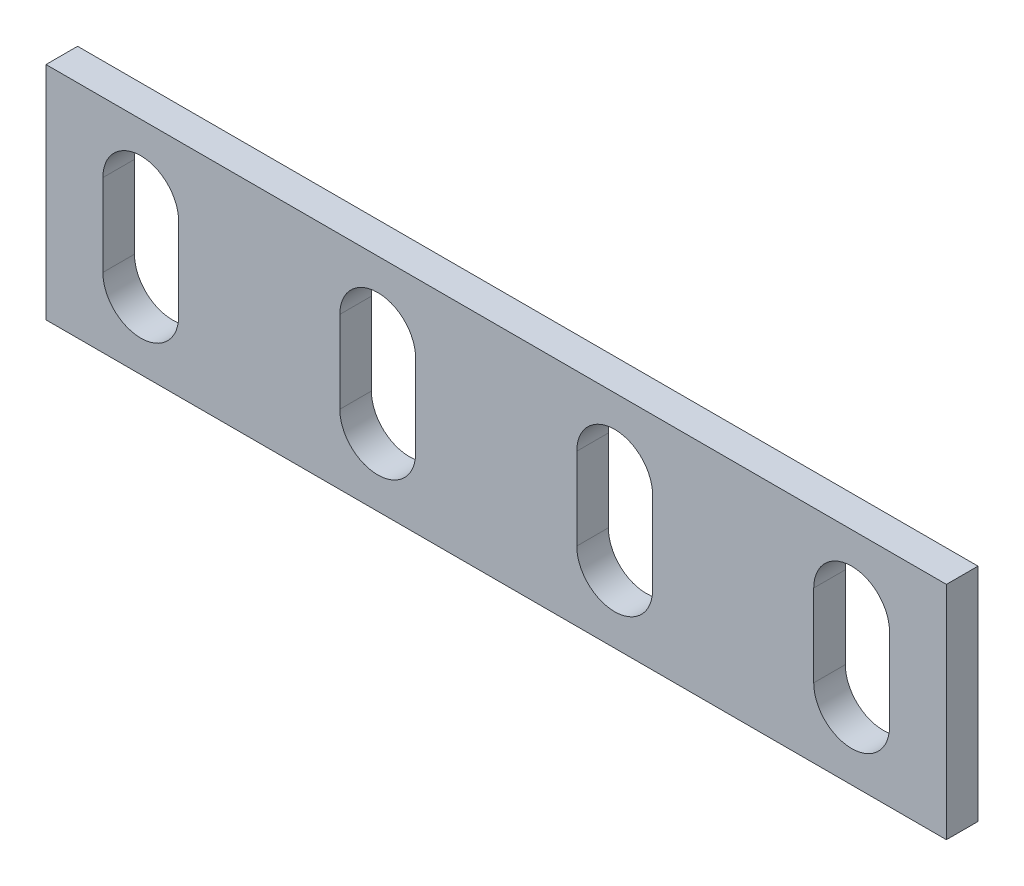
ISO-10303-21;
HEADER;
FILE_DESCRIPTION(('STEP AP214'),'2;1');
FILE_NAME('part.step','',(''),(''),'','','');
FILE_SCHEMA(('AUTOMOTIVE_DESIGN { 1 0 10303 214 1 1 1 1 }'));
ENDSEC;
DATA;
#1=APPLICATION_CONTEXT('core data for automotive mechanical design processes');
#2=APPLICATION_PROTOCOL_DEFINITION('international standard','automotive_design',2000,#1);
#3=PRODUCT_CONTEXT('',#1,'mechanical');
#4=PRODUCT('Part','Part','',(#3));
#5=PRODUCT_RELATED_PRODUCT_CATEGORY('part','',(#4));
#6=PRODUCT_DEFINITION_FORMATION('','',#4);
#7=PRODUCT_DEFINITION_CONTEXT('part definition',#1,'design');
#8=PRODUCT_DEFINITION('design','',#6,#7);
#9=PRODUCT_DEFINITION_SHAPE('','',#8);
#10=(LENGTH_UNIT() NAMED_UNIT(*) SI_UNIT(.MILLI.,.METRE.));
#11=(NAMED_UNIT(*) PLANE_ANGLE_UNIT() SI_UNIT($,.RADIAN.));
#12=(NAMED_UNIT(*) SI_UNIT($,.STERADIAN.) SOLID_ANGLE_UNIT());
#13=UNCERTAINTY_MEASURE_WITH_UNIT(LENGTH_MEASURE(1.E-05),#10,'distance_accuracy_value','');
#14=(GEOMETRIC_REPRESENTATION_CONTEXT(3) GLOBAL_UNCERTAINTY_ASSIGNED_CONTEXT((#13)) GLOBAL_UNIT_ASSIGNED_CONTEXT((#10,
#11,#12)) REPRESENTATION_CONTEXT('',''));
#15=CARTESIAN_POINT('',(0.,0.,0.));
#16=DIRECTION('',(0.,0.,1.));
#17=DIRECTION('',(1.,0.,0.));
#18=AXIS2_PLACEMENT_3D('',#15,#16,#17);
#19=CARTESIAN_POINT('',(0.,0.,20.));
#20=DIRECTION('',(0.,0.,1.));
#21=DIRECTION('',(1.,0.,0.));
#22=AXIS2_PLACEMENT_3D('',#19,#20,#21);
#23=PLANE('',#22);
#24=DIRECTION('',(0.,-1.,0.));
#25=VECTOR('',#24,1.);
#26=CARTESIAN_POINT('',(-285.,70.,20.));
#27=LINE('',#26,#25);
#28=CARTESIAN_POINT('',(-285.,70.,20.));
#29=VERTEX_POINT('',#28);
#30=CARTESIAN_POINT('',(-285.,-70.,20.));
#31=VERTEX_POINT('',#30);
#32=EDGE_CURVE('E354',#29,#31,#27,.T.);
#33=ORIENTED_EDGE('',*,*,#32,.T.);
#34=DIRECTION('',(1.,0.,0.));
#35=VECTOR('',#34,1.);
#36=CARTESIAN_POINT('',(-285.,-70.,20.));
#37=LINE('',#36,#35);
#38=CARTESIAN_POINT('',(285.,-70.,20.));
#39=VERTEX_POINT('',#38);
#40=EDGE_CURVE('E358',#31,#39,#37,.T.);
#41=ORIENTED_EDGE('',*,*,#40,.T.);
#42=DIRECTION('',(0.,1.,0.));
#43=VECTOR('',#42,1.);
#44=CARTESIAN_POINT('',(285.,70.,20.));
#45=LINE('',#44,#43);
#46=CARTESIAN_POINT('',(285.,70.,20.));
#47=VERTEX_POINT('',#46);
#48=EDGE_CURVE('E362',#39,#47,#45,.T.);
#49=ORIENTED_EDGE('',*,*,#48,.T.);
#50=DIRECTION('',(-1.,0.,0.));
#51=VECTOR('',#50,1.);
#52=CARTESIAN_POINT('',(-285.,70.,20.));
#53=LINE('',#52,#51);
#54=EDGE_CURVE('E365',#47,#29,#53,.T.);
#55=ORIENTED_EDGE('',*,*,#54,.T.);
#56=EDGE_LOOP('',(#33,#41,#49,#55));
#57=FACE_BOUND('',#56,.T.);
#58=DIRECTION('',(0.,-1.,0.));
#59=VECTOR('',#58,1.);
#60=CARTESIAN_POINT('',(51.,26.,20.));
#61=LINE('',#60,#59);
#62=CARTESIAN_POINT('',(51.,26.,20.));
#63=VERTEX_POINT('',#62);
#64=CARTESIAN_POINT('',(51.,-26.,20.));
#65=VERTEX_POINT('',#64);
#66=EDGE_CURVE('E314',#63,#65,#61,.T.);
#67=ORIENTED_EDGE('',*,*,#66,.F.);
#68=CARTESIAN_POINT('',(75.,26.,20.));
#69=DIRECTION('',(0.,0.,1.));
#70=DIRECTION('',(1.,0.,0.));
#71=AXIS2_PLACEMENT_3D('',#68,#69,#70);
#72=CIRCLE('',#71,24.);
#73=CARTESIAN_POINT('',(99.,26.,20.));
#74=VERTEX_POINT('',#73);
#75=EDGE_CURVE('E311',#74,#63,#72,.T.);
#76=ORIENTED_EDGE('',*,*,#75,.F.);
#77=DIRECTION('',(0.,1.,0.));
#78=VECTOR('',#77,1.);
#79=CARTESIAN_POINT('',(99.,26.,20.));
#80=LINE('',#79,#78);
#81=CARTESIAN_POINT('',(99.,-26.,20.));
#82=VERTEX_POINT('',#81);
#83=EDGE_CURVE('E322',#82,#74,#80,.T.);
#84=ORIENTED_EDGE('',*,*,#83,.F.);
#85=CARTESIAN_POINT('',(75.,-26.,20.));
#86=DIRECTION('',(0.,0.,1.));
#87=DIRECTION('',(1.,0.,0.));
#88=AXIS2_PLACEMENT_3D('',#85,#86,#87);
#89=CIRCLE('',#88,24.);
#90=EDGE_CURVE('E318',#65,#82,#89,.T.);
#91=ORIENTED_EDGE('',*,*,#90,.F.);
#92=EDGE_LOOP('',(#67,#76,#84,#91));
#93=FACE_BOUND('',#92,.T.);
#94=DIRECTION('',(0.,-1.,0.));
#95=VECTOR('',#94,1.);
#96=CARTESIAN_POINT('',(201.,26.,20.));
#97=LINE('',#96,#95);
#98=CARTESIAN_POINT('',(201.,26.,20.));
#99=VERTEX_POINT('',#98);
#100=CARTESIAN_POINT('',(201.,-26.,20.));
#101=VERTEX_POINT('',#100);
#102=EDGE_CURVE('E271',#99,#101,#97,.T.);
#103=ORIENTED_EDGE('',*,*,#102,.F.);
#104=CARTESIAN_POINT('',(225.,26.,20.));
#105=DIRECTION('',(0.,0.,1.));
#106=DIRECTION('',(1.,0.,0.));
#107=AXIS2_PLACEMENT_3D('',#104,#105,#106);
#108=CIRCLE('',#107,24.);
#109=CARTESIAN_POINT('',(249.,26.,20.));
#110=VERTEX_POINT('',#109);
#111=EDGE_CURVE('E268',#110,#99,#108,.T.);
#112=ORIENTED_EDGE('',*,*,#111,.F.);
#113=DIRECTION('',(0.,1.,0.));
#114=VECTOR('',#113,1.);
#115=CARTESIAN_POINT('',(249.,26.,20.));
#116=LINE('',#115,#114);
#117=CARTESIAN_POINT('',(249.,-26.,20.));
#118=VERTEX_POINT('',#117);
#119=EDGE_CURVE('E279',#118,#110,#116,.T.);
#120=ORIENTED_EDGE('',*,*,#119,.F.);
#121=CARTESIAN_POINT('',(225.,-26.,20.));
#122=DIRECTION('',(0.,0.,1.));
#123=DIRECTION('',(1.,0.,0.));
#124=AXIS2_PLACEMENT_3D('',#121,#122,#123);
#125=CIRCLE('',#124,24.);
#126=EDGE_CURVE('E275',#101,#118,#125,.T.);
#127=ORIENTED_EDGE('',*,*,#126,.F.);
#128=EDGE_LOOP('',(#103,#112,#120,#127));
#129=FACE_BOUND('',#128,.T.);
#130=DIRECTION('',(0.,-1.,0.));
#131=VECTOR('',#130,1.);
#132=CARTESIAN_POINT('',(-99.,26.,20.));
#133=LINE('',#132,#131);
#134=CARTESIAN_POINT('',(-99.,26.,20.));
#135=VERTEX_POINT('',#134);
#136=CARTESIAN_POINT('',(-99.,-26.,20.));
#137=VERTEX_POINT('',#136);
#138=EDGE_CURVE('E228',#135,#137,#133,.T.);
#139=ORIENTED_EDGE('',*,*,#138,.F.);
#140=CARTESIAN_POINT('',(-75.,26.,20.));
#141=DIRECTION('',(0.,0.,1.));
#142=DIRECTION('',(-1.,0.,0.));
#143=AXIS2_PLACEMENT_3D('',#140,#141,#142);
#144=CIRCLE('',#143,24.);
#145=CARTESIAN_POINT('',(-51.,26.,20.));
#146=VERTEX_POINT('',#145);
#147=EDGE_CURVE('E225',#146,#135,#144,.T.);
#148=ORIENTED_EDGE('',*,*,#147,.F.);
#149=DIRECTION('',(0.,1.,0.));
#150=VECTOR('',#149,1.);
#151=CARTESIAN_POINT('',(-51.,26.,20.));
#152=LINE('',#151,#150);
#153=CARTESIAN_POINT('',(-51.,-26.,20.));
#154=VERTEX_POINT('',#153);
#155=EDGE_CURVE('E236',#154,#146,#152,.T.);
#156=ORIENTED_EDGE('',*,*,#155,.F.);
#157=CARTESIAN_POINT('',(-75.,-26.,20.));
#158=DIRECTION('',(0.,0.,1.));
#159=DIRECTION('',(-1.,0.,0.));
#160=AXIS2_PLACEMENT_3D('',#157,#158,#159);
#161=CIRCLE('',#160,24.);
#162=EDGE_CURVE('E232',#137,#154,#161,.T.);
#163=ORIENTED_EDGE('',*,*,#162,.F.);
#164=EDGE_LOOP('',(#139,#148,#156,#163));
#165=FACE_BOUND('',#164,.T.);
#166=DIRECTION('',(0.,-1.,0.));
#167=VECTOR('',#166,1.);
#168=CARTESIAN_POINT('',(-249.,26.,20.));
#169=LINE('',#168,#167);
#170=CARTESIAN_POINT('',(-249.,26.,20.));
#171=VERTEX_POINT('',#170);
#172=CARTESIAN_POINT('',(-249.,-26.,20.));
#173=VERTEX_POINT('',#172);
#174=EDGE_CURVE('E186',#171,#173,#169,.T.);
#175=ORIENTED_EDGE('',*,*,#174,.F.);
#176=CARTESIAN_POINT('',(-225.,26.,20.));
#177=DIRECTION('',(0.,0.,1.));
#178=DIRECTION('',(-1.,0.,0.));
#179=AXIS2_PLACEMENT_3D('',#176,#177,#178);
#180=CIRCLE('',#179,24.);
#181=CARTESIAN_POINT('',(-201.,26.,20.));
#182=VERTEX_POINT('',#181);
#183=EDGE_CURVE('E177',#182,#171,#180,.T.);
#184=ORIENTED_EDGE('',*,*,#183,.F.);
#185=DIRECTION('',(0.,1.,0.));
#186=VECTOR('',#185,1.);
#187=CARTESIAN_POINT('',(-201.,26.,20.));
#188=LINE('',#187,#186);
#189=CARTESIAN_POINT('',(-201.,-26.,20.));
#190=VERTEX_POINT('',#189);
#191=EDGE_CURVE('E203',#190,#182,#188,.T.);
#192=ORIENTED_EDGE('',*,*,#191,.F.);
#193=CARTESIAN_POINT('',(-225.,-26.,20.));
#194=DIRECTION('',(0.,0.,1.));
#195=DIRECTION('',(-1.,0.,0.));
#196=AXIS2_PLACEMENT_3D('',#193,#194,#195);
#197=CIRCLE('',#196,24.);
#198=EDGE_CURVE('E199',#173,#190,#197,.T.);
#199=ORIENTED_EDGE('',*,*,#198,.F.);
#200=EDGE_LOOP('',(#175,#184,#192,#199));
#201=FACE_BOUND('',#200,.T.);
#202=ADVANCED_FACE('F39',(#57,#93,#129,#165,#201),#23,.T.);
#203=CARTESIAN_POINT('',(0.,0.,0.));
#204=DIRECTION('',(0.,0.,1.));
#205=DIRECTION('',(1.,0.,0.));
#206=AXIS2_PLACEMENT_3D('',#203,#204,#205);
#207=PLANE('',#206);
#208=CARTESIAN_POINT('',(-75.,26.,0.));
#209=DIRECTION('',(0.,0.,1.));
#210=DIRECTION('',(-1.,0.,0.));
#211=AXIS2_PLACEMENT_3D('',#208,#209,#210);
#212=CIRCLE('',#211,24.);
#213=CARTESIAN_POINT('',(-51.,26.,0.));
#214=VERTEX_POINT('',#213);
#215=CARTESIAN_POINT('',(-99.,26.,0.));
#216=VERTEX_POINT('',#215);
#217=EDGE_CURVE('E195',#214,#216,#212,.T.);
#218=ORIENTED_EDGE('',*,*,#217,.T.);
#219=DIRECTION('',(0.,-1.,0.));
#220=VECTOR('',#219,1.);
#221=CARTESIAN_POINT('',(-99.,26.,0.));
#222=LINE('',#221,#220);
#223=CARTESIAN_POINT('',(-99.,-26.,0.));
#224=VERTEX_POINT('',#223);
#225=EDGE_CURVE('E243',#216,#224,#222,.T.);
#226=ORIENTED_EDGE('',*,*,#225,.T.);
#227=CARTESIAN_POINT('',(-75.,-26.,0.));
#228=DIRECTION('',(0.,0.,1.));
#229=DIRECTION('',(-1.,0.,0.));
#230=AXIS2_PLACEMENT_3D('',#227,#228,#229);
#231=CIRCLE('',#230,24.);
#232=CARTESIAN_POINT('',(-51.,-26.,0.));
#233=VERTEX_POINT('',#232);
#234=EDGE_CURVE('E247',#224,#233,#231,.T.);
#235=ORIENTED_EDGE('',*,*,#234,.T.);
#236=DIRECTION('',(0.,1.,0.));
#237=VECTOR('',#236,1.);
#238=CARTESIAN_POINT('',(-51.,26.,0.));
#239=LINE('',#238,#237);
#240=EDGE_CURVE('E229',#233,#214,#239,.T.);
#241=ORIENTED_EDGE('',*,*,#240,.T.);
#242=EDGE_LOOP('',(#218,#226,#235,#241));
#243=FACE_BOUND('',#242,.T.);
#244=CARTESIAN_POINT('',(75.,26.,0.));
#245=DIRECTION('',(0.,0.,1.));
#246=DIRECTION('',(1.,0.,0.));
#247=AXIS2_PLACEMENT_3D('',#244,#245,#246);
#248=CIRCLE('',#247,24.);
#249=CARTESIAN_POINT('',(99.,26.,0.));
#250=VERTEX_POINT('',#249);
#251=CARTESIAN_POINT('',(51.,26.,0.));
#252=VERTEX_POINT('',#251);
#253=EDGE_CURVE('E310',#250,#252,#248,.T.);
#254=ORIENTED_EDGE('',*,*,#253,.T.);
#255=DIRECTION('',(0.,-1.,0.));
#256=VECTOR('',#255,1.);
#257=CARTESIAN_POINT('',(51.,26.,0.));
#258=LINE('',#257,#256);
#259=CARTESIAN_POINT('',(51.,-26.,0.));
#260=VERTEX_POINT('',#259);
#261=EDGE_CURVE('E329',#252,#260,#258,.T.);
#262=ORIENTED_EDGE('',*,*,#261,.T.);
#263=CARTESIAN_POINT('',(75.,-26.,0.));
#264=DIRECTION('',(0.,0.,1.));
#265=DIRECTION('',(1.,0.,0.));
#266=AXIS2_PLACEMENT_3D('',#263,#264,#265);
#267=CIRCLE('',#266,24.);
#268=CARTESIAN_POINT('',(99.,-26.,0.));
#269=VERTEX_POINT('',#268);
#270=EDGE_CURVE('E333',#260,#269,#267,.T.);
#271=ORIENTED_EDGE('',*,*,#270,.T.);
#272=DIRECTION('',(0.,1.,0.));
#273=VECTOR('',#272,1.);
#274=CARTESIAN_POINT('',(99.,26.,0.));
#275=LINE('',#274,#273);
#276=EDGE_CURVE('E315',#269,#250,#275,.T.);
#277=ORIENTED_EDGE('',*,*,#276,.T.);
#278=EDGE_LOOP('',(#254,#262,#271,#277));
#279=FACE_BOUND('',#278,.T.);
#280=DIRECTION('',(0.,-1.,0.));
#281=VECTOR('',#280,1.);
#282=CARTESIAN_POINT('',(-285.,70.,0.));
#283=LINE('',#282,#281);
#284=CARTESIAN_POINT('',(-285.,70.,0.));
#285=VERTEX_POINT('',#284);
#286=CARTESIAN_POINT('',(-285.,-70.,0.));
#287=VERTEX_POINT('',#286);
#288=EDGE_CURVE('E353',#285,#287,#283,.T.);
#289=ORIENTED_EDGE('',*,*,#288,.F.);
#290=DIRECTION('',(-1.,0.,0.));
#291=VECTOR('',#290,1.);
#292=CARTESIAN_POINT('',(-285.,70.,0.));
#293=LINE('',#292,#291);
#294=CARTESIAN_POINT('',(285.,70.,0.));
#295=VERTEX_POINT('',#294);
#296=EDGE_CURVE('E359',#295,#285,#293,.T.);
#297=ORIENTED_EDGE('',*,*,#296,.F.);
#298=DIRECTION('',(0.,1.,0.));
#299=VECTOR('',#298,1.);
#300=CARTESIAN_POINT('',(285.,70.,0.));
#301=LINE('',#300,#299);
#302=CARTESIAN_POINT('',(285.,-70.,0.));
#303=VERTEX_POINT('',#302);
#304=EDGE_CURVE('E375',#303,#295,#301,.T.);
#305=ORIENTED_EDGE('',*,*,#304,.F.);
#306=DIRECTION('',(1.,0.,0.));
#307=VECTOR('',#306,1.);
#308=CARTESIAN_POINT('',(-285.,-70.,0.));
#309=LINE('',#308,#307);
#310=EDGE_CURVE('E372',#287,#303,#309,.T.);
#311=ORIENTED_EDGE('',*,*,#310,.F.);
#312=EDGE_LOOP('',(#289,#297,#305,#311));
#313=FACE_BOUND('',#312,.T.);
#314=CARTESIAN_POINT('',(225.,26.,0.));
#315=DIRECTION('',(0.,0.,1.));
#316=DIRECTION('',(1.,0.,0.));
#317=AXIS2_PLACEMENT_3D('',#314,#315,#316);
#318=CIRCLE('',#317,24.);
#319=CARTESIAN_POINT('',(249.,26.,0.));
#320=VERTEX_POINT('',#319);
#321=CARTESIAN_POINT('',(201.,26.,0.));
#322=VERTEX_POINT('',#321);
#323=EDGE_CURVE('E267',#320,#322,#318,.T.);
#324=ORIENTED_EDGE('',*,*,#323,.T.);
#325=DIRECTION('',(0.,-1.,0.));
#326=VECTOR('',#325,1.);
#327=CARTESIAN_POINT('',(201.,26.,0.));
#328=LINE('',#327,#326);
#329=CARTESIAN_POINT('',(201.,-26.,0.));
#330=VERTEX_POINT('',#329);
#331=EDGE_CURVE('E286',#322,#330,#328,.T.);
#332=ORIENTED_EDGE('',*,*,#331,.T.);
#333=CARTESIAN_POINT('',(225.,-26.,0.));
#334=DIRECTION('',(0.,0.,1.));
#335=DIRECTION('',(1.,0.,0.));
#336=AXIS2_PLACEMENT_3D('',#333,#334,#335);
#337=CIRCLE('',#336,24.);
#338=CARTESIAN_POINT('',(249.,-26.,0.));
#339=VERTEX_POINT('',#338);
#340=EDGE_CURVE('E290',#330,#339,#337,.T.);
#341=ORIENTED_EDGE('',*,*,#340,.T.);
#342=DIRECTION('',(0.,1.,0.));
#343=VECTOR('',#342,1.);
#344=CARTESIAN_POINT('',(249.,26.,0.));
#345=LINE('',#344,#343);
#346=EDGE_CURVE('E272',#339,#320,#345,.T.);
#347=ORIENTED_EDGE('',*,*,#346,.T.);
#348=EDGE_LOOP('',(#324,#332,#341,#347));
#349=FACE_BOUND('',#348,.T.);
#350=CARTESIAN_POINT('',(-225.,26.,0.));
#351=DIRECTION('',(0.,0.,1.));
#352=DIRECTION('',(-1.,0.,0.));
#353=AXIS2_PLACEMENT_3D('',#350,#351,#352);
#354=CIRCLE('',#353,24.);
#355=CARTESIAN_POINT('',(-201.,26.,0.));
#356=VERTEX_POINT('',#355);
#357=CARTESIAN_POINT('',(-249.,26.,0.));
#358=VERTEX_POINT('',#357);
#359=EDGE_CURVE('E63',#356,#358,#354,.T.);
#360=ORIENTED_EDGE('',*,*,#359,.T.);
#361=DIRECTION('',(0.,-1.,0.));
#362=VECTOR('',#361,1.);
#363=CARTESIAN_POINT('',(-249.,26.,0.));
#364=LINE('',#363,#362);
#365=CARTESIAN_POINT('',(-249.,-26.,0.));
#366=VERTEX_POINT('',#365);
#367=EDGE_CURVE('E193',#358,#366,#364,.T.);
#368=ORIENTED_EDGE('',*,*,#367,.T.);
#369=CARTESIAN_POINT('',(-225.,-26.,0.));
#370=DIRECTION('',(0.,0.,1.));
#371=DIRECTION('',(-1.,0.,0.));
#372=AXIS2_PLACEMENT_3D('',#369,#370,#371);
#373=CIRCLE('',#372,24.);
#374=CARTESIAN_POINT('',(-201.,-26.,0.));
#375=VERTEX_POINT('',#374);
#376=EDGE_CURVE('E212',#366,#375,#373,.T.);
#377=ORIENTED_EDGE('',*,*,#376,.T.);
#378=DIRECTION('',(0.,1.,0.));
#379=VECTOR('',#378,1.);
#380=CARTESIAN_POINT('',(-201.,26.,0.));
#381=LINE('',#380,#379);
#382=EDGE_CURVE('E187',#375,#356,#381,.T.);
#383=ORIENTED_EDGE('',*,*,#382,.T.);
#384=EDGE_LOOP('',(#360,#368,#377,#383));
#385=FACE_BOUND('',#384,.T.);
#386=ADVANCED_FACE('F398',(#243,#279,#313,#349,#385),#207,.F.);
#387=CARTESIAN_POINT('',(-285.,70.,20.));
#388=DIRECTION('',(1.,0.,0.));
#389=DIRECTION('',(0.,0.,-1.));
#390=AXIS2_PLACEMENT_3D('',#387,#388,#389);
#391=PLANE('',#390);
#392=ORIENTED_EDGE('',*,*,#288,.T.);
#393=DIRECTION('',(0.,0.,-1.));
#394=VECTOR('',#393,1.);
#395=CARTESIAN_POINT('',(-285.,-70.,20.));
#396=LINE('',#395,#394);
#397=EDGE_CURVE('E11',#31,#287,#396,.T.);
#398=ORIENTED_EDGE('',*,*,#397,.F.);
#399=ORIENTED_EDGE('',*,*,#32,.F.);
#400=DIRECTION('',(0.,0.,-1.));
#401=VECTOR('',#400,1.);
#402=CARTESIAN_POINT('',(-285.,70.,20.));
#403=LINE('',#402,#401);
#404=EDGE_CURVE('E368',#29,#285,#403,.T.);
#405=ORIENTED_EDGE('',*,*,#404,.T.);
#406=EDGE_LOOP('',(#392,#398,#399,#405));
#407=FACE_BOUND('',#406,.T.);
#408=ADVANCED_FACE('F41',(#407),#391,.F.);
#409=CARTESIAN_POINT('',(-285.,-70.,20.));
#410=DIRECTION('',(0.,1.,0.));
#411=DIRECTION('',(0.,0.,1.));
#412=AXIS2_PLACEMENT_3D('',#409,#410,#411);
#413=PLANE('',#412);
#414=ORIENTED_EDGE('',*,*,#310,.T.);
#415=DIRECTION('',(0.,0.,-1.));
#416=VECTOR('',#415,1.);
#417=CARTESIAN_POINT('',(285.,-70.,20.));
#418=LINE('',#417,#416);
#419=EDGE_CURVE('E48',#39,#303,#418,.T.);
#420=ORIENTED_EDGE('',*,*,#419,.F.);
#421=ORIENTED_EDGE('',*,*,#40,.F.);
#422=ORIENTED_EDGE('',*,*,#397,.T.);
#423=EDGE_LOOP('',(#414,#420,#421,#422));
#424=FACE_BOUND('',#423,.T.);
#425=ADVANCED_FACE('F409',(#424),#413,.F.);
#426=CARTESIAN_POINT('',(285.,70.,20.));
#427=DIRECTION('',(-1.,0.,0.));
#428=DIRECTION('',(0.,0.,1.));
#429=AXIS2_PLACEMENT_3D('',#426,#427,#428);
#430=PLANE('',#429);
#431=ORIENTED_EDGE('',*,*,#304,.T.);
#432=DIRECTION('',(0.,0.,-1.));
#433=VECTOR('',#432,1.);
#434=CARTESIAN_POINT('',(285.,70.,20.));
#435=LINE('',#434,#433);
#436=EDGE_CURVE('E383',#47,#295,#435,.T.);
#437=ORIENTED_EDGE('',*,*,#436,.F.);
#438=ORIENTED_EDGE('',*,*,#48,.F.);
#439=ORIENTED_EDGE('',*,*,#419,.T.);
#440=EDGE_LOOP('',(#431,#437,#438,#439));
#441=FACE_BOUND('',#440,.T.);
#442=ADVANCED_FACE('F392',(#441),#430,.F.);
#443=CARTESIAN_POINT('',(-285.,70.,20.));
#444=DIRECTION('',(0.,-1.,0.));
#445=DIRECTION('',(0.,0.,-1.));
#446=AXIS2_PLACEMENT_3D('',#443,#444,#445);
#447=PLANE('',#446);
#448=ORIENTED_EDGE('',*,*,#296,.T.);
#449=ORIENTED_EDGE('',*,*,#404,.F.);
#450=ORIENTED_EDGE('',*,*,#54,.F.);
#451=ORIENTED_EDGE('',*,*,#436,.T.);
#452=EDGE_LOOP('',(#448,#449,#450,#451));
#453=FACE_BOUND('',#452,.T.);
#454=ADVANCED_FACE('F402',(#453),#447,.F.);
#455=CARTESIAN_POINT('',(75.,26.,20.));
#456=DIRECTION('',(0.,0.,-1.));
#457=DIRECTION('',(-1.,0.,0.));
#458=AXIS2_PLACEMENT_3D('',#455,#456,#457);
#459=CYLINDRICAL_SURFACE('',#458,24.);
#460=ORIENTED_EDGE('',*,*,#253,.F.);
#461=DIRECTION('',(0.,0.,-1.));
#462=VECTOR('',#461,1.);
#463=CARTESIAN_POINT('',(99.,26.,20.));
#464=LINE('',#463,#462);
#465=EDGE_CURVE('E325',#74,#250,#464,.T.);
#466=ORIENTED_EDGE('',*,*,#465,.F.);
#467=ORIENTED_EDGE('',*,*,#75,.T.);
#468=DIRECTION('',(0.,0.,-1.));
#469=VECTOR('',#468,1.);
#470=CARTESIAN_POINT('',(51.,26.,20.));
#471=LINE('',#470,#469);
#472=EDGE_CURVE('E349',#63,#252,#471,.T.);
#473=ORIENTED_EDGE('',*,*,#472,.T.);
#474=EDGE_LOOP('',(#460,#466,#467,#473));
#475=FACE_BOUND('',#474,.T.);
#476=ADVANCED_FACE('F424',(#475),#459,.F.);
#477=CARTESIAN_POINT('',(51.,26.,20.));
#478=DIRECTION('',(1.,0.,0.));
#479=DIRECTION('',(0.,0.,-1.));
#480=AXIS2_PLACEMENT_3D('',#477,#478,#479);
#481=PLANE('',#480);
#482=ORIENTED_EDGE('',*,*,#261,.F.);
#483=ORIENTED_EDGE('',*,*,#472,.F.);
#484=ORIENTED_EDGE('',*,*,#66,.T.);
#485=DIRECTION('',(0.,0.,-1.));
#486=VECTOR('',#485,1.);
#487=CARTESIAN_POINT('',(51.,-26.,20.));
#488=LINE('',#487,#486);
#489=EDGE_CURVE('E346',#65,#260,#488,.T.);
#490=ORIENTED_EDGE('',*,*,#489,.T.);
#491=EDGE_LOOP('',(#482,#483,#484,#490));
#492=FACE_BOUND('',#491,.T.);
#493=ADVANCED_FACE('F431',(#492),#481,.T.);
#494=CARTESIAN_POINT('',(75.,-26.,20.));
#495=DIRECTION('',(0.,0.,-1.));
#496=DIRECTION('',(-1.,0.,0.));
#497=AXIS2_PLACEMENT_3D('',#494,#495,#496);
#498=CYLINDRICAL_SURFACE('',#497,24.);
#499=ORIENTED_EDGE('',*,*,#270,.F.);
#500=ORIENTED_EDGE('',*,*,#489,.F.);
#501=ORIENTED_EDGE('',*,*,#90,.T.);
#502=DIRECTION('',(0.,0.,-1.));
#503=VECTOR('',#502,1.);
#504=CARTESIAN_POINT('',(99.,-26.,20.));
#505=LINE('',#504,#503);
#506=EDGE_CURVE('E343',#82,#269,#505,.T.);
#507=ORIENTED_EDGE('',*,*,#506,.T.);
#508=EDGE_LOOP('',(#499,#500,#501,#507));
#509=FACE_BOUND('',#508,.T.);
#510=ADVANCED_FACE('F436',(#509),#498,.F.);
#511=CARTESIAN_POINT('',(99.,26.,20.));
#512=DIRECTION('',(-1.,0.,0.));
#513=DIRECTION('',(0.,0.,1.));
#514=AXIS2_PLACEMENT_3D('',#511,#512,#513);
#515=PLANE('',#514);
#516=ORIENTED_EDGE('',*,*,#276,.F.);
#517=ORIENTED_EDGE('',*,*,#506,.F.);
#518=ORIENTED_EDGE('',*,*,#83,.T.);
#519=ORIENTED_EDGE('',*,*,#465,.T.);
#520=EDGE_LOOP('',(#516,#517,#518,#519));
#521=FACE_BOUND('',#520,.T.);
#522=ADVANCED_FACE('F444',(#521),#515,.T.);
#523=CARTESIAN_POINT('',(225.,26.,20.));
#524=DIRECTION('',(0.,0.,-1.));
#525=DIRECTION('',(-1.,0.,0.));
#526=AXIS2_PLACEMENT_3D('',#523,#524,#525);
#527=CYLINDRICAL_SURFACE('',#526,24.);
#528=ORIENTED_EDGE('',*,*,#323,.F.);
#529=DIRECTION('',(0.,0.,-1.));
#530=VECTOR('',#529,1.);
#531=CARTESIAN_POINT('',(249.,26.,20.));
#532=LINE('',#531,#530);
#533=EDGE_CURVE('E282',#110,#320,#532,.T.);
#534=ORIENTED_EDGE('',*,*,#533,.F.);
#535=ORIENTED_EDGE('',*,*,#111,.T.);
#536=DIRECTION('',(0.,0.,-1.));
#537=VECTOR('',#536,1.);
#538=CARTESIAN_POINT('',(201.,26.,20.));
#539=LINE('',#538,#537);
#540=EDGE_CURVE('E306',#99,#322,#539,.T.);
#541=ORIENTED_EDGE('',*,*,#540,.T.);
#542=EDGE_LOOP('',(#528,#534,#535,#541));
#543=FACE_BOUND('',#542,.T.);
#544=ADVANCED_FACE('F498',(#543),#527,.F.);
#545=CARTESIAN_POINT('',(201.,26.,20.));
#546=DIRECTION('',(1.,0.,0.));
#547=DIRECTION('',(0.,0.,-1.));
#548=AXIS2_PLACEMENT_3D('',#545,#546,#547);
#549=PLANE('',#548);
#550=ORIENTED_EDGE('',*,*,#331,.F.);
#551=ORIENTED_EDGE('',*,*,#540,.F.);
#552=ORIENTED_EDGE('',*,*,#102,.T.);
#553=DIRECTION('',(0.,0.,-1.));
#554=VECTOR('',#553,1.);
#555=CARTESIAN_POINT('',(201.,-26.,20.));
#556=LINE('',#555,#554);
#557=EDGE_CURVE('E303',#101,#330,#556,.T.);
#558=ORIENTED_EDGE('',*,*,#557,.T.);
#559=EDGE_LOOP('',(#550,#551,#552,#558));
#560=FACE_BOUND('',#559,.T.);
#561=ADVANCED_FACE('F494',(#560),#549,.T.);
#562=CARTESIAN_POINT('',(225.,-26.,20.));
#563=DIRECTION('',(0.,0.,-1.));
#564=DIRECTION('',(-1.,0.,0.));
#565=AXIS2_PLACEMENT_3D('',#562,#563,#564);
#566=CYLINDRICAL_SURFACE('',#565,24.);
#567=ORIENTED_EDGE('',*,*,#340,.F.);
#568=ORIENTED_EDGE('',*,*,#557,.F.);
#569=ORIENTED_EDGE('',*,*,#126,.T.);
#570=DIRECTION('',(0.,0.,-1.));
#571=VECTOR('',#570,1.);
#572=CARTESIAN_POINT('',(249.,-26.,20.));
#573=LINE('',#572,#571);
#574=EDGE_CURVE('E300',#118,#339,#573,.T.);
#575=ORIENTED_EDGE('',*,*,#574,.T.);
#576=EDGE_LOOP('',(#567,#568,#569,#575));
#577=FACE_BOUND('',#576,.T.);
#578=ADVANCED_FACE('F490',(#577),#566,.F.);
#579=CARTESIAN_POINT('',(249.,26.,20.));
#580=DIRECTION('',(-1.,0.,0.));
#581=DIRECTION('',(0.,0.,1.));
#582=AXIS2_PLACEMENT_3D('',#579,#580,#581);
#583=PLANE('',#582);
#584=ORIENTED_EDGE('',*,*,#346,.F.);
#585=ORIENTED_EDGE('',*,*,#574,.F.);
#586=ORIENTED_EDGE('',*,*,#119,.T.);
#587=ORIENTED_EDGE('',*,*,#533,.T.);
#588=EDGE_LOOP('',(#584,#585,#586,#587));
#589=FACE_BOUND('',#588,.T.);
#590=ADVANCED_FACE('F487',(#589),#583,.T.);
#591=CARTESIAN_POINT('',(-75.,26.,20.));
#592=DIRECTION('',(0.,0.,-1.));
#593=DIRECTION('',(-1.,0.,0.));
#594=AXIS2_PLACEMENT_3D('',#591,#592,#593);
#595=CYLINDRICAL_SURFACE('',#594,24.);
#596=ORIENTED_EDGE('',*,*,#217,.F.);
#597=DIRECTION('',(0.,0.,-1.));
#598=VECTOR('',#597,1.);
#599=CARTESIAN_POINT('',(-51.,26.,20.));
#600=LINE('',#599,#598);
#601=EDGE_CURVE('E239',#146,#214,#600,.T.);
#602=ORIENTED_EDGE('',*,*,#601,.F.);
#603=ORIENTED_EDGE('',*,*,#147,.T.);
#604=DIRECTION('',(0.,0.,-1.));
#605=VECTOR('',#604,1.);
#606=CARTESIAN_POINT('',(-99.,26.,20.));
#607=LINE('',#606,#605);
#608=EDGE_CURVE('E263',#135,#216,#607,.T.);
#609=ORIENTED_EDGE('',*,*,#608,.T.);
#610=EDGE_LOOP('',(#596,#602,#603,#609));
#611=FACE_BOUND('',#610,.T.);
#612=ADVANCED_FACE('F469',(#611),#595,.F.);
#613=CARTESIAN_POINT('',(-99.,26.,20.));
#614=DIRECTION('',(1.,0.,0.));
#615=DIRECTION('',(0.,0.,-1.));
#616=AXIS2_PLACEMENT_3D('',#613,#614,#615);
#617=PLANE('',#616);
#618=ORIENTED_EDGE('',*,*,#225,.F.);
#619=ORIENTED_EDGE('',*,*,#608,.F.);
#620=ORIENTED_EDGE('',*,*,#138,.T.);
#621=DIRECTION('',(0.,0.,-1.));
#622=VECTOR('',#621,1.);
#623=CARTESIAN_POINT('',(-99.,-26.,20.));
#624=LINE('',#623,#622);
#625=EDGE_CURVE('E260',#137,#224,#624,.T.);
#626=ORIENTED_EDGE('',*,*,#625,.T.);
#627=EDGE_LOOP('',(#618,#619,#620,#626));
#628=FACE_BOUND('',#627,.T.);
#629=ADVANCED_FACE('F463',(#628),#617,.T.);
#630=CARTESIAN_POINT('',(-75.,-26.,20.));
#631=DIRECTION('',(0.,0.,-1.));
#632=DIRECTION('',(-1.,0.,0.));
#633=AXIS2_PLACEMENT_3D('',#630,#631,#632);
#634=CYLINDRICAL_SURFACE('',#633,24.);
#635=ORIENTED_EDGE('',*,*,#234,.F.);
#636=ORIENTED_EDGE('',*,*,#625,.F.);
#637=ORIENTED_EDGE('',*,*,#162,.T.);
#638=DIRECTION('',(0.,0.,-1.));
#639=VECTOR('',#638,1.);
#640=CARTESIAN_POINT('',(-51.,-26.,20.));
#641=LINE('',#640,#639);
#642=EDGE_CURVE('E257',#154,#233,#641,.T.);
#643=ORIENTED_EDGE('',*,*,#642,.T.);
#644=EDGE_LOOP('',(#635,#636,#637,#643));
#645=FACE_BOUND('',#644,.T.);
#646=ADVANCED_FACE('F466',(#645),#634,.F.);
#647=CARTESIAN_POINT('',(-51.,26.,20.));
#648=DIRECTION('',(-1.,0.,0.));
#649=DIRECTION('',(0.,0.,1.));
#650=AXIS2_PLACEMENT_3D('',#647,#648,#649);
#651=PLANE('',#650);
#652=ORIENTED_EDGE('',*,*,#240,.F.);
#653=ORIENTED_EDGE('',*,*,#642,.F.);
#654=ORIENTED_EDGE('',*,*,#155,.T.);
#655=ORIENTED_EDGE('',*,*,#601,.T.);
#656=EDGE_LOOP('',(#652,#653,#654,#655));
#657=FACE_BOUND('',#656,.T.);
#658=ADVANCED_FACE('F472',(#657),#651,.T.);
#659=CARTESIAN_POINT('',(-225.,26.,20.));
#660=DIRECTION('',(0.,0.,-1.));
#661=DIRECTION('',(-1.,0.,0.));
#662=AXIS2_PLACEMENT_3D('',#659,#660,#661);
#663=CYLINDRICAL_SURFACE('',#662,24.);
#664=ORIENTED_EDGE('',*,*,#359,.F.);
#665=DIRECTION('',(0.,0.,-1.));
#666=VECTOR('',#665,1.);
#667=CARTESIAN_POINT('',(-201.,26.,20.));
#668=LINE('',#667,#666);
#669=EDGE_CURVE('E181',#182,#356,#668,.T.);
#670=ORIENTED_EDGE('',*,*,#669,.F.);
#671=ORIENTED_EDGE('',*,*,#183,.T.);
#672=DIRECTION('',(0.,0.,-1.));
#673=VECTOR('',#672,1.);
#674=CARTESIAN_POINT('',(-249.,26.,20.));
#675=LINE('',#674,#673);
#676=EDGE_CURVE('E180',#171,#358,#675,.T.);
#677=ORIENTED_EDGE('',*,*,#676,.T.);
#678=EDGE_LOOP('',(#664,#670,#671,#677));
#679=FACE_BOUND('',#678,.T.);
#680=ADVANCED_FACE('F179',(#679),#663,.F.);
#681=CARTESIAN_POINT('',(-249.,26.,20.));
#682=DIRECTION('',(1.,0.,0.));
#683=DIRECTION('',(0.,0.,-1.));
#684=AXIS2_PLACEMENT_3D('',#681,#682,#683);
#685=PLANE('',#684);
#686=ORIENTED_EDGE('',*,*,#367,.F.);
#687=ORIENTED_EDGE('',*,*,#676,.F.);
#688=ORIENTED_EDGE('',*,*,#174,.T.);
#689=DIRECTION('',(0.,0.,-1.));
#690=VECTOR('',#689,1.);
#691=CARTESIAN_POINT('',(-249.,-26.,20.));
#692=LINE('',#691,#690);
#693=EDGE_CURVE('E196',#173,#366,#692,.T.);
#694=ORIENTED_EDGE('',*,*,#693,.T.);
#695=EDGE_LOOP('',(#686,#687,#688,#694));
#696=FACE_BOUND('',#695,.T.);
#697=ADVANCED_FACE('F190',(#696),#685,.T.);
#698=CARTESIAN_POINT('',(-225.,-26.,20.));
#699=DIRECTION('',(0.,0.,-1.));
#700=DIRECTION('',(-1.,0.,0.));
#701=AXIS2_PLACEMENT_3D('',#698,#699,#700);
#702=CYLINDRICAL_SURFACE('',#701,24.);
#703=ORIENTED_EDGE('',*,*,#376,.F.);
#704=ORIENTED_EDGE('',*,*,#693,.F.);
#705=ORIENTED_EDGE('',*,*,#198,.T.);
#706=DIRECTION('',(0.,0.,-1.));
#707=VECTOR('',#706,1.);
#708=CARTESIAN_POINT('',(-201.,-26.,20.));
#709=LINE('',#708,#707);
#710=EDGE_CURVE('E55',#190,#375,#709,.T.);
#711=ORIENTED_EDGE('',*,*,#710,.T.);
#712=EDGE_LOOP('',(#703,#704,#705,#711));
#713=FACE_BOUND('',#712,.T.);
#714=ADVANCED_FACE('F561',(#713),#702,.F.);
#715=CARTESIAN_POINT('',(-201.,26.,20.));
#716=DIRECTION('',(-1.,0.,0.));
#717=DIRECTION('',(0.,0.,1.));
#718=AXIS2_PLACEMENT_3D('',#715,#716,#717);
#719=PLANE('',#718);
#720=ORIENTED_EDGE('',*,*,#382,.F.);
#721=ORIENTED_EDGE('',*,*,#710,.F.);
#722=ORIENTED_EDGE('',*,*,#191,.T.);
#723=ORIENTED_EDGE('',*,*,#669,.T.);
#724=EDGE_LOOP('',(#720,#721,#722,#723));
#725=FACE_BOUND('',#724,.T.);
#726=ADVANCED_FACE('F569',(#725),#719,.T.);
#727=CLOSED_SHELL('',(#202,#386,#408,#425,#442,#454,#476,#493,#510,#522,#544,#561,#578,#590,
#612,#629,#646,#658,#680,#697,#714,#726));
#728=MANIFOLD_SOLID_BREP('B2',#727);
#729=ADVANCED_BREP_SHAPE_REPRESENTATION('',(#18,#728),#14);
#730=SHAPE_DEFINITION_REPRESENTATION(#9,#729);
ENDSEC;
END-ISO-10303-21;
